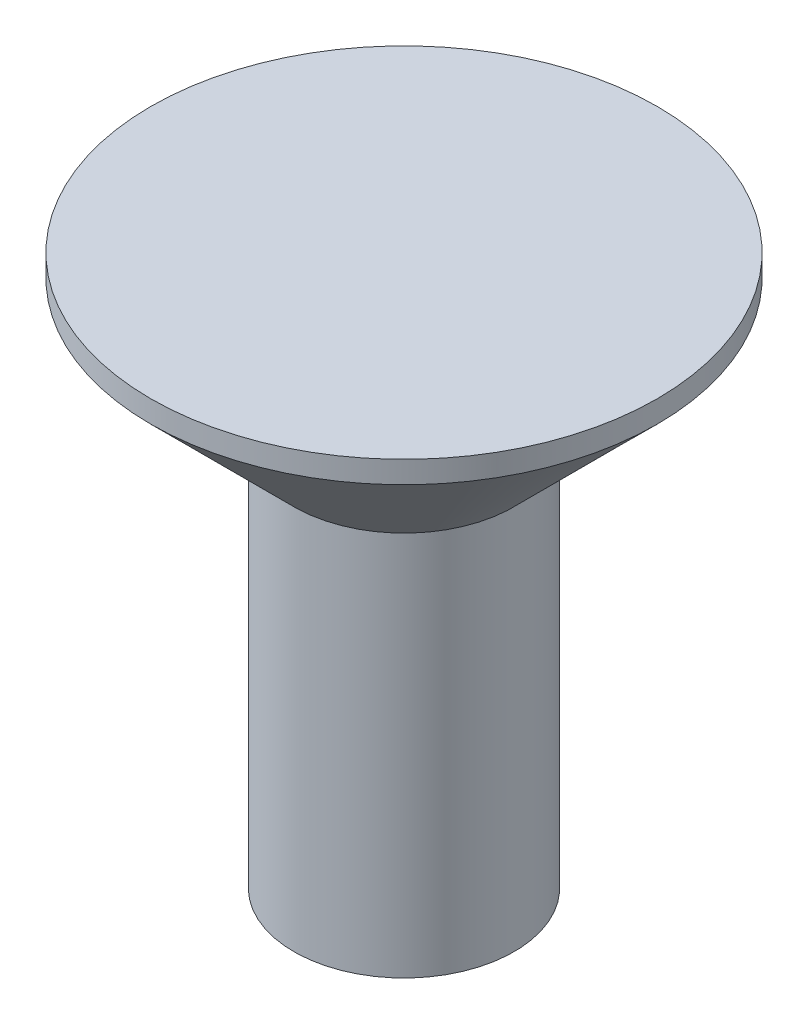
ISO-10303-21;
HEADER;
FILE_DESCRIPTION(('STEP AP214'),'2;1');
FILE_NAME('part.step','',(''),(''),'','','');
FILE_SCHEMA(('AUTOMOTIVE_DESIGN { 1 0 10303 214 1 1 1 1 }'));
ENDSEC;
DATA;
#1=APPLICATION_CONTEXT('core data for automotive mechanical design processes');
#2=APPLICATION_PROTOCOL_DEFINITION('international standard','automotive_design',2000,#1);
#3=PRODUCT_CONTEXT('',#1,'mechanical');
#4=PRODUCT('Part','Part','',(#3));
#5=PRODUCT_RELATED_PRODUCT_CATEGORY('part','',(#4));
#6=PRODUCT_DEFINITION_FORMATION('','',#4);
#7=PRODUCT_DEFINITION_CONTEXT('part definition',#1,'design');
#8=PRODUCT_DEFINITION('design','',#6,#7);
#9=PRODUCT_DEFINITION_SHAPE('','',#8);
#10=(LENGTH_UNIT() NAMED_UNIT(*) SI_UNIT(.MILLI.,.METRE.));
#11=(NAMED_UNIT(*) PLANE_ANGLE_UNIT() SI_UNIT($,.RADIAN.));
#12=(NAMED_UNIT(*) SI_UNIT($,.STERADIAN.) SOLID_ANGLE_UNIT());
#13=UNCERTAINTY_MEASURE_WITH_UNIT(LENGTH_MEASURE(1.E-05),#10,'distance_accuracy_value','');
#14=(GEOMETRIC_REPRESENTATION_CONTEXT(3) GLOBAL_UNCERTAINTY_ASSIGNED_CONTEXT((#13)) GLOBAL_UNIT_ASSIGNED_CONTEXT((#10,
#11,#12)) REPRESENTATION_CONTEXT('',''));
#15=CARTESIAN_POINT('',(0.,0.,0.));
#16=DIRECTION('',(0.,0.,1.));
#17=DIRECTION('',(1.,0.,0.));
#18=AXIS2_PLACEMENT_3D('',#15,#16,#17);
#19=CARTESIAN_POINT('',(0.,0.,0.));
#20=DIRECTION('',(0.,1.,0.));
#21=DIRECTION('',(-1.,0.,0.));
#22=AXIS2_PLACEMENT_3D('',#19,#20,#21);
#23=PLANE('',#22);
#24=CARTESIAN_POINT('',(0.,0.,0.));
#25=DIRECTION('',(0.,1.,0.));
#26=DIRECTION('',(-1.,0.,0.));
#27=AXIS2_PLACEMENT_3D('',#24,#25,#26);
#28=CIRCLE('',#27,12.7);
#29=CARTESIAN_POINT('',(-12.7,0.,0.));
#30=VERTEX_POINT('',#29);
#31=EDGE_CURVE('E10',#30,#30,#28,.T.);
#32=ORIENTED_EDGE('',*,*,#31,.F.);
#33=EDGE_LOOP('',(#32));
#34=FACE_BOUND('',#33,.T.);
#35=ADVANCED_FACE('F32',(#34),#23,.F.);
#36=CARTESIAN_POINT('',(0.,63.5,0.));
#37=DIRECTION('',(0.,1.,0.));
#38=DIRECTION('',(-1.,0.,0.));
#39=AXIS2_PLACEMENT_3D('',#36,#37,#38);
#40=CYLINDRICAL_SURFACE('',#39,12.7);
#41=CARTESIAN_POINT('',(0.,44.45,0.));
#42=DIRECTION('',(0.,1.,0.));
#43=DIRECTION('',(-1.,0.,0.));
#44=AXIS2_PLACEMENT_3D('',#41,#42,#43);
#45=CIRCLE('',#44,12.7);
#46=CARTESIAN_POINT('',(-12.7,44.45,0.));
#47=VERTEX_POINT('',#46);
#48=EDGE_CURVE('E38',#47,#47,#45,.T.);
#49=ORIENTED_EDGE('',*,*,#48,.F.);
#50=EDGE_LOOP('',(#49));
#51=FACE_BOUND('',#50,.T.);
#52=ORIENTED_EDGE('',*,*,#31,.T.);
#53=EDGE_LOOP('',(#52));
#54=FACE_BOUND('',#53,.T.);
#55=ADVANCED_FACE('F62',(#51,#54),#40,.T.);
#56=CARTESIAN_POINT('',(0.,44.45,0.));
#57=DIRECTION('',(0.,1.,0.));
#58=DIRECTION('',(-1.,0.,0.));
#59=AXIS2_PLACEMENT_3D('',#56,#57,#58);
#60=CONICAL_SURFACE('',#59,12.7,0.785398163397454);
#61=CARTESIAN_POINT('',(0.,60.9599999999998,0.));
#62=DIRECTION('',(0.,1.,0.));
#63=DIRECTION('',(-1.,0.,0.));
#64=AXIS2_PLACEMENT_3D('',#61,#62,#63);
#65=CIRCLE('',#64,29.21);
#66=CARTESIAN_POINT('',(-29.21,60.9599999999998,0.));
#67=VERTEX_POINT('',#66);
#68=EDGE_CURVE('E42',#67,#67,#65,.T.);
#69=ORIENTED_EDGE('',*,*,#68,.F.);
#70=EDGE_LOOP('',(#69));
#71=FACE_BOUND('',#70,.T.);
#72=ORIENTED_EDGE('',*,*,#48,.T.);
#73=EDGE_LOOP('',(#72));
#74=FACE_BOUND('',#73,.T.);
#75=ADVANCED_FACE('F57',(#71,#74),#60,.T.);
#76=CARTESIAN_POINT('',(0.,63.5,0.));
#77=DIRECTION('',(0.,1.,0.));
#78=DIRECTION('',(-1.,0.,0.));
#79=AXIS2_PLACEMENT_3D('',#76,#77,#78);
#80=CYLINDRICAL_SURFACE('',#79,29.21);
#81=CARTESIAN_POINT('',(0.,63.5,0.));
#82=DIRECTION('',(0.,1.,0.));
#83=DIRECTION('',(-1.,0.,0.));
#84=AXIS2_PLACEMENT_3D('',#81,#82,#83);
#85=CIRCLE('',#84,29.21);
#86=CARTESIAN_POINT('',(-29.21,63.5,0.));
#87=VERTEX_POINT('',#86);
#88=EDGE_CURVE('E46',#87,#87,#85,.T.);
#89=ORIENTED_EDGE('',*,*,#88,.F.);
#90=EDGE_LOOP('',(#89));
#91=FACE_BOUND('',#90,.T.);
#92=ORIENTED_EDGE('',*,*,#68,.T.);
#93=EDGE_LOOP('',(#92));
#94=FACE_BOUND('',#93,.T.);
#95=ADVANCED_FACE('F54',(#91,#94),#80,.T.);
#96=CARTESIAN_POINT('',(29.21,63.5,0.));
#97=DIRECTION('',(0.,-1.,0.));
#98=DIRECTION('',(1.,0.,0.));
#99=AXIS2_PLACEMENT_3D('',#96,#97,#98);
#100=PLANE('',#99);
#101=ORIENTED_EDGE('',*,*,#88,.T.);
#102=EDGE_LOOP('',(#101));
#103=FACE_BOUND('',#102,.T.);
#104=ADVANCED_FACE('F52',(#103),#100,.F.);
#105=CLOSED_SHELL('',(#35,#55,#75,#95,#104));
#106=MANIFOLD_SOLID_BREP('B2',#105);
#107=ADVANCED_BREP_SHAPE_REPRESENTATION('',(#18,#106),#14);
#108=SHAPE_DEFINITION_REPRESENTATION(#9,#107);
ENDSEC;
END-ISO-10303-21;
